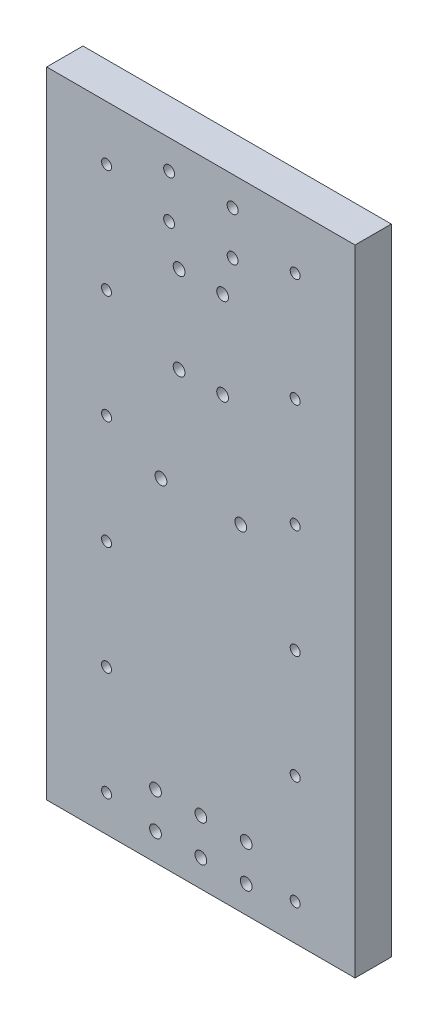
ISO-10303-21;
HEADER;
FILE_DESCRIPTION(('STEP AP214'),'2;1');
FILE_NAME('part.step','',(''),(''),'','','');
FILE_SCHEMA(('AUTOMOTIVE_DESIGN { 1 0 10303 214 1 1 1 1 }'));
ENDSEC;
DATA;
#1=APPLICATION_CONTEXT('core data for automotive mechanical design processes');
#2=APPLICATION_PROTOCOL_DEFINITION('international standard','automotive_design',2000,#1);
#3=PRODUCT_CONTEXT('',#1,'mechanical');
#4=PRODUCT('Part','Part','',(#3));
#5=PRODUCT_RELATED_PRODUCT_CATEGORY('part','',(#4));
#6=PRODUCT_DEFINITION_FORMATION('','',#4);
#7=PRODUCT_DEFINITION_CONTEXT('part definition',#1,'design');
#8=PRODUCT_DEFINITION('design','',#6,#7);
#9=PRODUCT_DEFINITION_SHAPE('','',#8);
#10=(LENGTH_UNIT() NAMED_UNIT(*) SI_UNIT(.MILLI.,.METRE.));
#11=(NAMED_UNIT(*) PLANE_ANGLE_UNIT() SI_UNIT($,.RADIAN.));
#12=(NAMED_UNIT(*) SI_UNIT($,.STERADIAN.) SOLID_ANGLE_UNIT());
#13=UNCERTAINTY_MEASURE_WITH_UNIT(LENGTH_MEASURE(1.E-05),#10,'distance_accuracy_value','');
#14=(GEOMETRIC_REPRESENTATION_CONTEXT(3) GLOBAL_UNCERTAINTY_ASSIGNED_CONTEXT((#13)) GLOBAL_UNIT_ASSIGNED_CONTEXT((#10,
#11,#12)) REPRESENTATION_CONTEXT('',''));
#15=CARTESIAN_POINT('',(0.,0.,0.));
#16=DIRECTION('',(0.,0.,1.));
#17=DIRECTION('',(1.,0.,0.));
#18=AXIS2_PLACEMENT_3D('',#15,#16,#17);
#19=CARTESIAN_POINT('',(-52.,320.,-30.));
#20=DIRECTION('',(0.,0.,1.));
#21=DIRECTION('',(1.,0.,0.));
#22=AXIS2_PLACEMENT_3D('',#19,#20,#21);
#23=CYLINDRICAL_SURFACE('',#22,2.75);
#24=CARTESIAN_POINT('',(-52.,320.,0.));
#25=DIRECTION('',(0.,0.,-1.));
#26=DIRECTION('',(-1.,0.,0.));
#27=AXIS2_PLACEMENT_3D('',#24,#25,#26);
#28=CIRCLE('',#27,2.75);
#29=CARTESIAN_POINT('',(-54.75,320.,0.));
#30=VERTEX_POINT('',#29);
#31=EDGE_CURVE('E43',#30,#30,#28,.T.);
#32=ORIENTED_EDGE('',*,*,#31,.T.);
#33=EDGE_LOOP('',(#32));
#34=FACE_BOUND('',#33,.T.);
#35=CARTESIAN_POINT('',(-52.,320.,20.));
#36=DIRECTION('',(0.,0.,1.));
#37=DIRECTION('',(-1.,0.,0.));
#38=AXIS2_PLACEMENT_3D('',#35,#36,#37);
#39=CIRCLE('',#38,2.75);
#40=CARTESIAN_POINT('',(-54.75,320.,20.));
#41=VERTEX_POINT('',#40);
#42=EDGE_CURVE('E11',#41,#41,#39,.T.);
#43=ORIENTED_EDGE('',*,*,#42,.T.);
#44=EDGE_LOOP('',(#43));
#45=FACE_BOUND('',#44,.T.);
#46=ADVANCED_FACE('F34',(#34,#45),#23,.F.);
#47=CARTESIAN_POINT('',(-52.,260.,-30.));
#48=DIRECTION('',(0.,0.,1.));
#49=DIRECTION('',(1.,0.,0.));
#50=AXIS2_PLACEMENT_3D('',#47,#48,#49);
#51=CYLINDRICAL_SURFACE('',#50,2.75);
#52=CARTESIAN_POINT('',(-52.,260.,0.));
#53=DIRECTION('',(0.,0.,-1.));
#54=DIRECTION('',(-1.,0.,0.));
#55=AXIS2_PLACEMENT_3D('',#52,#53,#54);
#56=CIRCLE('',#55,2.75);
#57=CARTESIAN_POINT('',(-54.75,260.,0.));
#58=VERTEX_POINT('',#57);
#59=EDGE_CURVE('E158',#58,#58,#56,.T.);
#60=ORIENTED_EDGE('',*,*,#59,.T.);
#61=EDGE_LOOP('',(#60));
#62=FACE_BOUND('',#61,.T.);
#63=CARTESIAN_POINT('',(-52.,260.,20.));
#64=DIRECTION('',(0.,0.,1.));
#65=DIRECTION('',(-1.,0.,0.));
#66=AXIS2_PLACEMENT_3D('',#63,#64,#65);
#67=CIRCLE('',#66,2.75);
#68=CARTESIAN_POINT('',(-54.75,260.,20.));
#69=VERTEX_POINT('',#68);
#70=EDGE_CURVE('E161',#69,#69,#67,.T.);
#71=ORIENTED_EDGE('',*,*,#70,.T.);
#72=EDGE_LOOP('',(#71));
#73=FACE_BOUND('',#72,.T.);
#74=ADVANCED_FACE('F286',(#62,#73),#51,.F.);
#75=CARTESIAN_POINT('',(-52.,200.,-30.));
#76=DIRECTION('',(0.,0.,1.));
#77=DIRECTION('',(1.,0.,0.));
#78=AXIS2_PLACEMENT_3D('',#75,#76,#77);
#79=CYLINDRICAL_SURFACE('',#78,2.75);
#80=CARTESIAN_POINT('',(-52.,200.,0.));
#81=DIRECTION('',(0.,0.,-1.));
#82=DIRECTION('',(-1.,0.,0.));
#83=AXIS2_PLACEMENT_3D('',#80,#81,#82);
#84=CIRCLE('',#83,2.75);
#85=CARTESIAN_POINT('',(-54.75,200.,0.));
#86=VERTEX_POINT('',#85);
#87=EDGE_CURVE('E152',#86,#86,#84,.T.);
#88=ORIENTED_EDGE('',*,*,#87,.T.);
#89=EDGE_LOOP('',(#88));
#90=FACE_BOUND('',#89,.T.);
#91=CARTESIAN_POINT('',(-52.,200.,20.));
#92=DIRECTION('',(0.,0.,1.));
#93=DIRECTION('',(-1.,0.,0.));
#94=AXIS2_PLACEMENT_3D('',#91,#92,#93);
#95=CIRCLE('',#94,2.75);
#96=CARTESIAN_POINT('',(-54.75,200.,20.));
#97=VERTEX_POINT('',#96);
#98=EDGE_CURVE('E155',#97,#97,#95,.T.);
#99=ORIENTED_EDGE('',*,*,#98,.T.);
#100=EDGE_LOOP('',(#99));
#101=FACE_BOUND('',#100,.T.);
#102=ADVANCED_FACE('F291',(#90,#101),#79,.F.);
#103=CARTESIAN_POINT('',(-52.,140.,-30.));
#104=DIRECTION('',(0.,0.,1.));
#105=DIRECTION('',(1.,0.,0.));
#106=AXIS2_PLACEMENT_3D('',#103,#104,#105);
#107=CYLINDRICAL_SURFACE('',#106,2.75);
#108=CARTESIAN_POINT('',(-52.,140.,0.));
#109=DIRECTION('',(0.,0.,-1.));
#110=DIRECTION('',(-1.,0.,0.));
#111=AXIS2_PLACEMENT_3D('',#108,#109,#110);
#112=CIRCLE('',#111,2.75);
#113=CARTESIAN_POINT('',(-54.75,140.,0.));
#114=VERTEX_POINT('',#113);
#115=EDGE_CURVE('E146',#114,#114,#112,.T.);
#116=ORIENTED_EDGE('',*,*,#115,.T.);
#117=EDGE_LOOP('',(#116));
#118=FACE_BOUND('',#117,.T.);
#119=CARTESIAN_POINT('',(-52.,140.,20.));
#120=DIRECTION('',(0.,0.,1.));
#121=DIRECTION('',(-1.,0.,0.));
#122=AXIS2_PLACEMENT_3D('',#119,#120,#121);
#123=CIRCLE('',#122,2.75);
#124=CARTESIAN_POINT('',(-54.75,140.,20.));
#125=VERTEX_POINT('',#124);
#126=EDGE_CURVE('E149',#125,#125,#123,.T.);
#127=ORIENTED_EDGE('',*,*,#126,.T.);
#128=EDGE_LOOP('',(#127));
#129=FACE_BOUND('',#128,.T.);
#130=ADVANCED_FACE('F337',(#118,#129),#107,.F.);
#131=CARTESIAN_POINT('',(52.,320.,-30.));
#132=DIRECTION('',(0.,0.,1.));
#133=DIRECTION('',(1.,0.,0.));
#134=AXIS2_PLACEMENT_3D('',#131,#132,#133);
#135=CYLINDRICAL_SURFACE('',#134,2.75);
#136=CARTESIAN_POINT('',(52.,320.,0.));
#137=DIRECTION('',(0.,0.,-1.));
#138=DIRECTION('',(-1.,0.,0.));
#139=AXIS2_PLACEMENT_3D('',#136,#137,#138);
#140=CIRCLE('',#139,2.75);
#141=CARTESIAN_POINT('',(49.25,320.,0.));
#142=VERTEX_POINT('',#141);
#143=EDGE_CURVE('E140',#142,#142,#140,.T.);
#144=ORIENTED_EDGE('',*,*,#143,.T.);
#145=EDGE_LOOP('',(#144));
#146=FACE_BOUND('',#145,.T.);
#147=CARTESIAN_POINT('',(52.,320.,20.));
#148=DIRECTION('',(0.,0.,1.));
#149=DIRECTION('',(1.,0.,0.));
#150=AXIS2_PLACEMENT_3D('',#147,#148,#149);
#151=CIRCLE('',#150,2.75);
#152=CARTESIAN_POINT('',(54.75,320.,20.));
#153=VERTEX_POINT('',#152);
#154=EDGE_CURVE('E143',#153,#153,#151,.T.);
#155=ORIENTED_EDGE('',*,*,#154,.T.);
#156=EDGE_LOOP('',(#155));
#157=FACE_BOUND('',#156,.T.);
#158=ADVANCED_FACE('F333',(#146,#157),#135,.F.);
#159=CARTESIAN_POINT('',(52.,260.,-30.));
#160=DIRECTION('',(0.,0.,1.));
#161=DIRECTION('',(1.,0.,0.));
#162=AXIS2_PLACEMENT_3D('',#159,#160,#161);
#163=CYLINDRICAL_SURFACE('',#162,2.75);
#164=CARTESIAN_POINT('',(52.,260.,0.));
#165=DIRECTION('',(0.,0.,-1.));
#166=DIRECTION('',(-1.,0.,0.));
#167=AXIS2_PLACEMENT_3D('',#164,#165,#166);
#168=CIRCLE('',#167,2.75);
#169=CARTESIAN_POINT('',(49.25,260.,0.));
#170=VERTEX_POINT('',#169);
#171=EDGE_CURVE('E134',#170,#170,#168,.T.);
#172=ORIENTED_EDGE('',*,*,#171,.T.);
#173=EDGE_LOOP('',(#172));
#174=FACE_BOUND('',#173,.T.);
#175=CARTESIAN_POINT('',(52.,260.,20.));
#176=DIRECTION('',(0.,0.,1.));
#177=DIRECTION('',(1.,0.,0.));
#178=AXIS2_PLACEMENT_3D('',#175,#176,#177);
#179=CIRCLE('',#178,2.75);
#180=CARTESIAN_POINT('',(54.75,260.,20.));
#181=VERTEX_POINT('',#180);
#182=EDGE_CURVE('E137',#181,#181,#179,.T.);
#183=ORIENTED_EDGE('',*,*,#182,.T.);
#184=EDGE_LOOP('',(#183));
#185=FACE_BOUND('',#184,.T.);
#186=ADVANCED_FACE('F329',(#174,#185),#163,.F.);
#187=CARTESIAN_POINT('',(52.,200.,-30.));
#188=DIRECTION('',(0.,0.,1.));
#189=DIRECTION('',(1.,0.,0.));
#190=AXIS2_PLACEMENT_3D('',#187,#188,#189);
#191=CYLINDRICAL_SURFACE('',#190,2.75);
#192=CARTESIAN_POINT('',(52.,200.,0.));
#193=DIRECTION('',(0.,0.,-1.));
#194=DIRECTION('',(-1.,0.,0.));
#195=AXIS2_PLACEMENT_3D('',#192,#193,#194);
#196=CIRCLE('',#195,2.75);
#197=CARTESIAN_POINT('',(49.25,200.,0.));
#198=VERTEX_POINT('',#197);
#199=EDGE_CURVE('E128',#198,#198,#196,.T.);
#200=ORIENTED_EDGE('',*,*,#199,.T.);
#201=EDGE_LOOP('',(#200));
#202=FACE_BOUND('',#201,.T.);
#203=CARTESIAN_POINT('',(52.,200.,20.));
#204=DIRECTION('',(0.,0.,1.));
#205=DIRECTION('',(1.,0.,0.));
#206=AXIS2_PLACEMENT_3D('',#203,#204,#205);
#207=CIRCLE('',#206,2.75);
#208=CARTESIAN_POINT('',(54.75,200.,20.));
#209=VERTEX_POINT('',#208);
#210=EDGE_CURVE('E131',#209,#209,#207,.T.);
#211=ORIENTED_EDGE('',*,*,#210,.T.);
#212=EDGE_LOOP('',(#211));
#213=FACE_BOUND('',#212,.T.);
#214=ADVANCED_FACE('F325',(#202,#213),#191,.F.);
#215=CARTESIAN_POINT('',(52.,140.,-30.));
#216=DIRECTION('',(0.,0.,1.));
#217=DIRECTION('',(1.,0.,0.));
#218=AXIS2_PLACEMENT_3D('',#215,#216,#217);
#219=CYLINDRICAL_SURFACE('',#218,2.75);
#220=CARTESIAN_POINT('',(52.,140.,0.));
#221=DIRECTION('',(0.,0.,-1.));
#222=DIRECTION('',(-1.,0.,0.));
#223=AXIS2_PLACEMENT_3D('',#220,#221,#222);
#224=CIRCLE('',#223,2.75);
#225=CARTESIAN_POINT('',(49.25,140.,0.));
#226=VERTEX_POINT('',#225);
#227=EDGE_CURVE('E114',#226,#226,#224,.T.);
#228=ORIENTED_EDGE('',*,*,#227,.T.);
#229=EDGE_LOOP('',(#228));
#230=FACE_BOUND('',#229,.T.);
#231=CARTESIAN_POINT('',(52.,140.,20.));
#232=DIRECTION('',(0.,0.,1.));
#233=DIRECTION('',(1.,0.,0.));
#234=AXIS2_PLACEMENT_3D('',#231,#232,#233);
#235=CIRCLE('',#234,2.75);
#236=CARTESIAN_POINT('',(54.75,140.,20.));
#237=VERTEX_POINT('',#236);
#238=EDGE_CURVE('E125',#237,#237,#235,.T.);
#239=ORIENTED_EDGE('',*,*,#238,.T.);
#240=EDGE_LOOP('',(#239));
#241=FACE_BOUND('',#240,.T.);
#242=ADVANCED_FACE('F321',(#230,#241),#219,.F.);
#243=CARTESIAN_POINT('',(-85.,0.,20.));
#244=DIRECTION('',(1.,0.,0.));
#245=DIRECTION('',(0.,0.,-1.));
#246=AXIS2_PLACEMENT_3D('',#243,#244,#245);
#247=PLANE('',#246);
#248=DIRECTION('',(0.,-1.,0.));
#249=VECTOR('',#248,1.);
#250=CARTESIAN_POINT('',(-85.,0.,0.));
#251=LINE('',#250,#249);
#252=CARTESIAN_POINT('',(-85.,350.,0.));
#253=VERTEX_POINT('',#252);
#254=CARTESIAN_POINT('',(-85.,0.,0.));
#255=VERTEX_POINT('',#254);
#256=EDGE_CURVE('E104',#253,#255,#251,.T.);
#257=ORIENTED_EDGE('',*,*,#256,.T.);
#258=DIRECTION('',(0.,0.,-1.));
#259=VECTOR('',#258,1.);
#260=CARTESIAN_POINT('',(-85.,0.,20.));
#261=LINE('',#260,#259);
#262=CARTESIAN_POINT('',(-85.,0.,20.));
#263=VERTEX_POINT('',#262);
#264=EDGE_CURVE('E95',#263,#255,#261,.T.);
#265=ORIENTED_EDGE('',*,*,#264,.F.);
#266=DIRECTION('',(0.,-1.,0.));
#267=VECTOR('',#266,1.);
#268=CARTESIAN_POINT('',(-85.,0.,20.));
#269=LINE('',#268,#267);
#270=CARTESIAN_POINT('',(-85.,350.,20.));
#271=VERTEX_POINT('',#270);
#272=EDGE_CURVE('E89',#271,#263,#269,.T.);
#273=ORIENTED_EDGE('',*,*,#272,.F.);
#274=DIRECTION('',(0.,0.,-1.));
#275=VECTOR('',#274,1.);
#276=CARTESIAN_POINT('',(-85.,350.,20.));
#277=LINE('',#276,#275);
#278=EDGE_CURVE('E100',#271,#253,#277,.T.);
#279=ORIENTED_EDGE('',*,*,#278,.T.);
#280=EDGE_LOOP('',(#257,#265,#273,#279));
#281=FACE_BOUND('',#280,.T.);
#282=ADVANCED_FACE('F318',(#281),#247,.F.);
#283=CARTESIAN_POINT('',(-85.,0.,20.));
#284=DIRECTION('',(0.,1.,0.));
#285=DIRECTION('',(0.,0.,1.));
#286=AXIS2_PLACEMENT_3D('',#283,#284,#285);
#287=PLANE('',#286);
#288=DIRECTION('',(1.,0.,0.));
#289=VECTOR('',#288,1.);
#290=CARTESIAN_POINT('',(-85.,0.,0.));
#291=LINE('',#290,#289);
#292=CARTESIAN_POINT('',(85.,0.,0.));
#293=VERTEX_POINT('',#292);
#294=EDGE_CURVE('E94',#255,#293,#291,.T.);
#295=ORIENTED_EDGE('',*,*,#294,.T.);
#296=DIRECTION('',(0.,0.,-1.));
#297=VECTOR('',#296,1.);
#298=CARTESIAN_POINT('',(85.,0.,20.));
#299=LINE('',#298,#297);
#300=CARTESIAN_POINT('',(85.,0.,20.));
#301=VERTEX_POINT('',#300);
#302=EDGE_CURVE('E92',#301,#293,#299,.T.);
#303=ORIENTED_EDGE('',*,*,#302,.F.);
#304=DIRECTION('',(1.,0.,0.));
#305=VECTOR('',#304,1.);
#306=CARTESIAN_POINT('',(-85.,0.,20.));
#307=LINE('',#306,#305);
#308=EDGE_CURVE('E83',#263,#301,#307,.T.);
#309=ORIENTED_EDGE('',*,*,#308,.F.);
#310=ORIENTED_EDGE('',*,*,#264,.T.);
#311=EDGE_LOOP('',(#295,#303,#309,#310));
#312=FACE_BOUND('',#311,.T.);
#313=ADVANCED_FACE('F93',(#312),#287,.F.);
#314=CARTESIAN_POINT('',(85.,0.,20.));
#315=DIRECTION('',(-1.,0.,0.));
#316=DIRECTION('',(0.,0.,1.));
#317=AXIS2_PLACEMENT_3D('',#314,#315,#316);
#318=PLANE('',#317);
#319=DIRECTION('',(0.,1.,0.));
#320=VECTOR('',#319,1.);
#321=CARTESIAN_POINT('',(85.,0.,0.));
#322=LINE('',#321,#320);
#323=CARTESIAN_POINT('',(85.,350.,0.));
#324=VERTEX_POINT('',#323);
#325=EDGE_CURVE('E69',#293,#324,#322,.T.);
#326=ORIENTED_EDGE('',*,*,#325,.T.);
#327=DIRECTION('',(0.,0.,-1.));
#328=VECTOR('',#327,1.);
#329=CARTESIAN_POINT('',(85.,350.,20.));
#330=LINE('',#329,#328);
#331=CARTESIAN_POINT('',(85.,350.,20.));
#332=VERTEX_POINT('',#331);
#333=EDGE_CURVE('E96',#332,#324,#330,.T.);
#334=ORIENTED_EDGE('',*,*,#333,.F.);
#335=DIRECTION('',(0.,1.,0.));
#336=VECTOR('',#335,1.);
#337=CARTESIAN_POINT('',(85.,0.,20.));
#338=LINE('',#337,#336);
#339=EDGE_CURVE('E87',#301,#332,#338,.T.);
#340=ORIENTED_EDGE('',*,*,#339,.F.);
#341=ORIENTED_EDGE('',*,*,#302,.T.);
#342=EDGE_LOOP('',(#326,#334,#340,#341));
#343=FACE_BOUND('',#342,.T.);
#344=ADVANCED_FACE('F98',(#343),#318,.F.);
#345=CARTESIAN_POINT('',(-85.,350.,20.));
#346=DIRECTION('',(0.,-1.,0.));
#347=DIRECTION('',(0.,0.,-1.));
#348=AXIS2_PLACEMENT_3D('',#345,#346,#347);
#349=PLANE('',#348);
#350=DIRECTION('',(-1.,0.,0.));
#351=VECTOR('',#350,1.);
#352=CARTESIAN_POINT('',(-85.,350.,0.));
#353=LINE('',#352,#351);
#354=EDGE_CURVE('E75',#324,#253,#353,.T.);
#355=ORIENTED_EDGE('',*,*,#354,.T.);
#356=ORIENTED_EDGE('',*,*,#278,.F.);
#357=DIRECTION('',(-1.,0.,0.));
#358=VECTOR('',#357,1.);
#359=CARTESIAN_POINT('',(-85.,350.,20.));
#360=LINE('',#359,#358);
#361=EDGE_CURVE('E52',#332,#271,#360,.T.);
#362=ORIENTED_EDGE('',*,*,#361,.F.);
#363=ORIENTED_EDGE('',*,*,#333,.T.);
#364=EDGE_LOOP('',(#355,#356,#362,#363));
#365=FACE_BOUND('',#364,.T.);
#366=ADVANCED_FACE('F299',(#365),#349,.F.);
#367=CARTESIAN_POINT('',(0.,0.,20.));
#368=DIRECTION('',(0.,0.,-1.));
#369=DIRECTION('',(-1.,0.,0.));
#370=AXIS2_PLACEMENT_3D('',#367,#368,#369);
#371=PLANE('',#370);
#372=CARTESIAN_POINT('',(-22.,185.,20.));
#373=DIRECTION('',(0.,0.,1.));
#374=DIRECTION('',(-1.,0.,0.));
#375=AXIS2_PLACEMENT_3D('',#372,#373,#374);
#376=CIRCLE('',#375,3.25);
#377=CARTESIAN_POINT('',(-25.25,185.,20.));
#378=VERTEX_POINT('',#377);
#379=EDGE_CURVE('E603',#378,#378,#376,.T.);
#380=ORIENTED_EDGE('',*,*,#379,.F.);
#381=EDGE_LOOP('',(#380));
#382=FACE_BOUND('',#381,.T.);
#383=CARTESIAN_POINT('',(-12.,290.,20.));
#384=DIRECTION('',(0.,0.,1.));
#385=DIRECTION('',(-1.,0.,0.));
#386=AXIS2_PLACEMENT_3D('',#383,#384,#385);
#387=CIRCLE('',#386,3.25);
#388=CARTESIAN_POINT('',(-15.25,290.,20.));
#389=VERTEX_POINT('',#388);
#390=EDGE_CURVE('E612',#389,#389,#387,.T.);
#391=ORIENTED_EDGE('',*,*,#390,.F.);
#392=EDGE_LOOP('',(#391));
#393=FACE_BOUND('',#392,.T.);
#394=CARTESIAN_POINT('',(12.,242.,20.));
#395=DIRECTION('',(0.,0.,1.));
#396=DIRECTION('',(1.,0.,0.));
#397=AXIS2_PLACEMENT_3D('',#394,#395,#396);
#398=CIRCLE('',#397,3.25);
#399=CARTESIAN_POINT('',(15.25,242.,20.));
#400=VERTEX_POINT('',#399);
#401=EDGE_CURVE('E609',#400,#400,#398,.T.);
#402=ORIENTED_EDGE('',*,*,#401,.F.);
#403=EDGE_LOOP('',(#402));
#404=FACE_BOUND('',#403,.T.);
#405=CARTESIAN_POINT('',(-12.,242.,20.));
#406=DIRECTION('',(0.,0.,1.));
#407=DIRECTION('',(-1.,0.,0.));
#408=AXIS2_PLACEMENT_3D('',#405,#406,#407);
#409=CIRCLE('',#408,3.25);
#410=CARTESIAN_POINT('',(-15.25,242.,20.));
#411=VERTEX_POINT('',#410);
#412=EDGE_CURVE('E606',#411,#411,#409,.T.);
#413=ORIENTED_EDGE('',*,*,#412,.F.);
#414=EDGE_LOOP('',(#413));
#415=FACE_BOUND('',#414,.T.);
#416=CARTESIAN_POINT('',(22.,185.,20.));
#417=DIRECTION('',(0.,0.,1.));
#418=DIRECTION('',(1.,0.,0.));
#419=AXIS2_PLACEMENT_3D('',#416,#417,#418);
#420=CIRCLE('',#419,3.25);
#421=CARTESIAN_POINT('',(25.25,185.,20.));
#422=VERTEX_POINT('',#421);
#423=EDGE_CURVE('E604',#422,#422,#420,.T.);
#424=ORIENTED_EDGE('',*,*,#423,.F.);
#425=EDGE_LOOP('',(#424));
#426=FACE_BOUND('',#425,.T.);
#427=CARTESIAN_POINT('',(12.,290.,20.));
#428=DIRECTION('',(0.,0.,1.));
#429=DIRECTION('',(1.,0.,0.));
#430=AXIS2_PLACEMENT_3D('',#427,#428,#429);
#431=CIRCLE('',#430,3.25);
#432=CARTESIAN_POINT('',(15.25,290.,20.));
#433=VERTEX_POINT('',#432);
#434=EDGE_CURVE('E190',#433,#433,#431,.T.);
#435=ORIENTED_EDGE('',*,*,#434,.F.);
#436=EDGE_LOOP('',(#435));
#437=FACE_BOUND('',#436,.T.);
#438=CARTESIAN_POINT('',(25.,15.,20.));
#439=DIRECTION('',(0.,0.,1.));
#440=DIRECTION('',(1.,0.,0.));
#441=AXIS2_PLACEMENT_3D('',#438,#439,#440);
#442=CIRCLE('',#441,3.25);
#443=CARTESIAN_POINT('',(28.25,15.,20.));
#444=VERTEX_POINT('',#443);
#445=EDGE_CURVE('E217',#444,#444,#442,.T.);
#446=ORIENTED_EDGE('',*,*,#445,.F.);
#447=EDGE_LOOP('',(#446));
#448=FACE_BOUND('',#447,.T.);
#449=CARTESIAN_POINT('',(-25.,15.,20.));
#450=DIRECTION('',(0.,0.,1.));
#451=DIRECTION('',(-1.,0.,0.));
#452=AXIS2_PLACEMENT_3D('',#449,#450,#451);
#453=CIRCLE('',#452,3.25);
#454=CARTESIAN_POINT('',(-28.25,15.,20.));
#455=VERTEX_POINT('',#454);
#456=EDGE_CURVE('E220',#455,#455,#453,.T.);
#457=ORIENTED_EDGE('',*,*,#456,.F.);
#458=EDGE_LOOP('',(#457));
#459=FACE_BOUND('',#458,.T.);
#460=CARTESIAN_POINT('',(25.,35.,20.));
#461=DIRECTION('',(0.,0.,1.));
#462=DIRECTION('',(-1.,0.,0.));
#463=AXIS2_PLACEMENT_3D('',#460,#461,#462);
#464=CIRCLE('',#463,3.25);
#465=CARTESIAN_POINT('',(21.75,35.,20.));
#466=VERTEX_POINT('',#465);
#467=EDGE_CURVE('E212',#466,#466,#464,.T.);
#468=ORIENTED_EDGE('',*,*,#467,.F.);
#469=EDGE_LOOP('',(#468));
#470=FACE_BOUND('',#469,.T.);
#471=CARTESIAN_POINT('',(0.,35.,20.));
#472=DIRECTION('',(0.,0.,1.));
#473=DIRECTION('',(-1.,0.,0.));
#474=AXIS2_PLACEMENT_3D('',#471,#472,#473);
#475=CIRCLE('',#474,3.25);
#476=CARTESIAN_POINT('',(-3.25,35.,20.));
#477=VERTEX_POINT('',#476);
#478=EDGE_CURVE('E207',#477,#477,#475,.T.);
#479=ORIENTED_EDGE('',*,*,#478,.F.);
#480=EDGE_LOOP('',(#479));
#481=FACE_BOUND('',#480,.T.);
#482=CARTESIAN_POINT('',(-25.,35.,20.));
#483=DIRECTION('',(0.,0.,1.));
#484=DIRECTION('',(1.,0.,0.));
#485=AXIS2_PLACEMENT_3D('',#482,#483,#484);
#486=CIRCLE('',#485,3.25);
#487=CARTESIAN_POINT('',(-21.75,35.,20.));
#488=VERTEX_POINT('',#487);
#489=EDGE_CURVE('E203',#488,#488,#486,.T.);
#490=ORIENTED_EDGE('',*,*,#489,.F.);
#491=EDGE_LOOP('',(#490));
#492=FACE_BOUND('',#491,.T.);
#493=CARTESIAN_POINT('',(0.,15.,20.));
#494=DIRECTION('',(0.,0.,1.));
#495=DIRECTION('',(1.,0.,0.));
#496=AXIS2_PLACEMENT_3D('',#493,#494,#495);
#497=CIRCLE('',#496,3.25);
#498=CARTESIAN_POINT('',(3.25,15.,20.));
#499=VERTEX_POINT('',#498);
#500=EDGE_CURVE('E170',#499,#499,#497,.T.);
#501=ORIENTED_EDGE('',*,*,#500,.F.);
#502=EDGE_LOOP('',(#501));
#503=FACE_BOUND('',#502,.T.);
#504=CARTESIAN_POINT('',(-52.,80.,20.));
#505=DIRECTION('',(0.,0.,1.));
#506=DIRECTION('',(-1.,0.,0.));
#507=AXIS2_PLACEMENT_3D('',#504,#505,#506);
#508=CIRCLE('',#507,2.75);
#509=CARTESIAN_POINT('',(-54.75,80.,20.));
#510=VERTEX_POINT('',#509);
#511=EDGE_CURVE('E229',#510,#510,#508,.T.);
#512=ORIENTED_EDGE('',*,*,#511,.F.);
#513=EDGE_LOOP('',(#512));
#514=FACE_BOUND('',#513,.T.);
#515=CARTESIAN_POINT('',(52.,80.,20.));
#516=DIRECTION('',(0.,0.,1.));
#517=DIRECTION('',(1.,0.,0.));
#518=AXIS2_PLACEMENT_3D('',#515,#516,#517);
#519=CIRCLE('',#518,2.75);
#520=CARTESIAN_POINT('',(54.75,80.,20.));
#521=VERTEX_POINT('',#520);
#522=EDGE_CURVE('E235',#521,#521,#519,.T.);
#523=ORIENTED_EDGE('',*,*,#522,.F.);
#524=EDGE_LOOP('',(#523));
#525=FACE_BOUND('',#524,.T.);
#526=CARTESIAN_POINT('',(52.,20.,20.));
#527=DIRECTION('',(0.,0.,1.));
#528=DIRECTION('',(1.,0.,0.));
#529=AXIS2_PLACEMENT_3D('',#526,#527,#528);
#530=CIRCLE('',#529,2.75);
#531=CARTESIAN_POINT('',(54.75,20.,20.));
#532=VERTEX_POINT('',#531);
#533=EDGE_CURVE('E119',#532,#532,#530,.T.);
#534=ORIENTED_EDGE('',*,*,#533,.F.);
#535=EDGE_LOOP('',(#534));
#536=FACE_BOUND('',#535,.T.);
#537=CARTESIAN_POINT('',(-52.,20.,20.));
#538=DIRECTION('',(0.,0.,1.));
#539=DIRECTION('',(-1.,0.,0.));
#540=AXIS2_PLACEMENT_3D('',#537,#538,#539);
#541=CIRCLE('',#540,2.75);
#542=CARTESIAN_POINT('',(-54.75,20.,20.));
#543=VERTEX_POINT('',#542);
#544=EDGE_CURVE('E238',#543,#543,#541,.T.);
#545=ORIENTED_EDGE('',*,*,#544,.F.);
#546=EDGE_LOOP('',(#545));
#547=FACE_BOUND('',#546,.T.);
#548=CARTESIAN_POINT('',(17.5,334.,20.));
#549=DIRECTION('',(0.,0.,-1.));
#550=DIRECTION('',(-1.,0.,0.));
#551=AXIS2_PLACEMENT_3D('',#548,#549,#550);
#552=CIRCLE('',#551,3.);
#553=CARTESIAN_POINT('',(14.5,334.,20.));
#554=VERTEX_POINT('',#553);
#555=EDGE_CURVE('E107',#554,#554,#552,.T.);
#556=ORIENTED_EDGE('',*,*,#555,.T.);
#557=EDGE_LOOP('',(#556));
#558=FACE_BOUND('',#557,.T.);
#559=CARTESIAN_POINT('',(17.5,310.,20.));
#560=DIRECTION('',(0.,0.,-1.));
#561=DIRECTION('',(-1.,0.,0.));
#562=AXIS2_PLACEMENT_3D('',#559,#560,#561);
#563=CIRCLE('',#562,3.);
#564=CARTESIAN_POINT('',(14.5,310.,20.));
#565=VERTEX_POINT('',#564);
#566=EDGE_CURVE('E260',#565,#565,#563,.T.);
#567=ORIENTED_EDGE('',*,*,#566,.T.);
#568=EDGE_LOOP('',(#567));
#569=FACE_BOUND('',#568,.T.);
#570=CARTESIAN_POINT('',(-17.5,310.,20.));
#571=DIRECTION('',(0.,0.,-1.));
#572=DIRECTION('',(-1.,0.,0.));
#573=AXIS2_PLACEMENT_3D('',#570,#571,#572);
#574=CIRCLE('',#573,3.);
#575=CARTESIAN_POINT('',(-20.5,310.,20.));
#576=VERTEX_POINT('',#575);
#577=EDGE_CURVE('E257',#576,#576,#574,.T.);
#578=ORIENTED_EDGE('',*,*,#577,.T.);
#579=EDGE_LOOP('',(#578));
#580=FACE_BOUND('',#579,.T.);
#581=CARTESIAN_POINT('',(-17.5,334.,20.));
#582=DIRECTION('',(0.,0.,-1.));
#583=DIRECTION('',(-1.,0.,0.));
#584=AXIS2_PLACEMENT_3D('',#581,#582,#583);
#585=CIRCLE('',#584,3.);
#586=CARTESIAN_POINT('',(-20.5,334.,20.));
#587=VERTEX_POINT('',#586);
#588=EDGE_CURVE('E254',#587,#587,#585,.T.);
#589=ORIENTED_EDGE('',*,*,#588,.T.);
#590=EDGE_LOOP('',(#589));
#591=FACE_BOUND('',#590,.T.);
#592=ORIENTED_EDGE('',*,*,#272,.T.);
#593=ORIENTED_EDGE('',*,*,#308,.T.);
#594=ORIENTED_EDGE('',*,*,#339,.T.);
#595=ORIENTED_EDGE('',*,*,#361,.T.);
#596=EDGE_LOOP('',(#592,#593,#594,#595));
#597=FACE_BOUND('',#596,.T.);
#598=ORIENTED_EDGE('',*,*,#238,.F.);
#599=EDGE_LOOP('',(#598));
#600=FACE_BOUND('',#599,.T.);
#601=ORIENTED_EDGE('',*,*,#210,.F.);
#602=EDGE_LOOP('',(#601));
#603=FACE_BOUND('',#602,.T.);
#604=ORIENTED_EDGE('',*,*,#182,.F.);
#605=EDGE_LOOP('',(#604));
#606=FACE_BOUND('',#605,.T.);
#607=ORIENTED_EDGE('',*,*,#154,.F.);
#608=EDGE_LOOP('',(#607));
#609=FACE_BOUND('',#608,.T.);
#610=ORIENTED_EDGE('',*,*,#126,.F.);
#611=EDGE_LOOP('',(#610));
#612=FACE_BOUND('',#611,.T.);
#613=ORIENTED_EDGE('',*,*,#98,.F.);
#614=EDGE_LOOP('',(#613));
#615=FACE_BOUND('',#614,.T.);
#616=ORIENTED_EDGE('',*,*,#70,.F.);
#617=EDGE_LOOP('',(#616));
#618=FACE_BOUND('',#617,.T.);
#619=ORIENTED_EDGE('',*,*,#42,.F.);
#620=EDGE_LOOP('',(#619));
#621=FACE_BOUND('',#620,.T.);
#622=ADVANCED_FACE('F84',(#382,#393,#404,#415,#426,#437,#448,#459,#470,#481,#492,#503,#514,#525,
#536,#547,#558,#569,#580,#591,#597,#600,#603,#606,#609,#612,#615,#618,#621),#371,.F.);
#623=CARTESIAN_POINT('',(0.,0.,0.));
#624=DIRECTION('',(0.,0.,-1.));
#625=DIRECTION('',(-1.,0.,0.));
#626=AXIS2_PLACEMENT_3D('',#623,#624,#625);
#627=PLANE('',#626);
#628=CARTESIAN_POINT('',(-22.,185.,0.));
#629=DIRECTION('',(0.,0.,-1.));
#630=DIRECTION('',(-1.,0.,0.));
#631=AXIS2_PLACEMENT_3D('',#628,#629,#630);
#632=CIRCLE('',#631,3.25);
#633=CARTESIAN_POINT('',(-25.25,185.,0.));
#634=VERTEX_POINT('',#633);
#635=EDGE_CURVE('E37',#634,#634,#632,.T.);
#636=ORIENTED_EDGE('',*,*,#635,.F.);
#637=EDGE_LOOP('',(#636));
#638=FACE_BOUND('',#637,.T.);
#639=CARTESIAN_POINT('',(-12.,290.,0.));
#640=DIRECTION('',(0.,0.,-1.));
#641=DIRECTION('',(-1.,0.,0.));
#642=AXIS2_PLACEMENT_3D('',#639,#640,#641);
#643=CIRCLE('',#642,3.25);
#644=CARTESIAN_POINT('',(-15.25,290.,0.));
#645=VERTEX_POINT('',#644);
#646=EDGE_CURVE('E198',#645,#645,#643,.T.);
#647=ORIENTED_EDGE('',*,*,#646,.F.);
#648=EDGE_LOOP('',(#647));
#649=FACE_BOUND('',#648,.T.);
#650=CARTESIAN_POINT('',(12.,242.,0.));
#651=DIRECTION('',(0.,0.,-1.));
#652=DIRECTION('',(-1.,0.,0.));
#653=AXIS2_PLACEMENT_3D('',#650,#651,#652);
#654=CIRCLE('',#653,3.25);
#655=CARTESIAN_POINT('',(8.75,242.,0.));
#656=VERTEX_POINT('',#655);
#657=EDGE_CURVE('E196',#656,#656,#654,.T.);
#658=ORIENTED_EDGE('',*,*,#657,.F.);
#659=EDGE_LOOP('',(#658));
#660=FACE_BOUND('',#659,.T.);
#661=CARTESIAN_POINT('',(-12.,242.,0.));
#662=DIRECTION('',(0.,0.,-1.));
#663=DIRECTION('',(-1.,0.,0.));
#664=AXIS2_PLACEMENT_3D('',#661,#662,#663);
#665=CIRCLE('',#664,3.25);
#666=CARTESIAN_POINT('',(-15.25,242.,0.));
#667=VERTEX_POINT('',#666);
#668=EDGE_CURVE('E193',#667,#667,#665,.T.);
#669=ORIENTED_EDGE('',*,*,#668,.F.);
#670=EDGE_LOOP('',(#669));
#671=FACE_BOUND('',#670,.T.);
#672=CARTESIAN_POINT('',(22.,185.,0.));
#673=DIRECTION('',(0.,0.,-1.));
#674=DIRECTION('',(-1.,0.,0.));
#675=AXIS2_PLACEMENT_3D('',#672,#673,#674);
#676=CIRCLE('',#675,3.25);
#677=CARTESIAN_POINT('',(18.75,185.,0.));
#678=VERTEX_POINT('',#677);
#679=EDGE_CURVE('E189',#678,#678,#676,.T.);
#680=ORIENTED_EDGE('',*,*,#679,.F.);
#681=EDGE_LOOP('',(#680));
#682=FACE_BOUND('',#681,.T.);
#683=CARTESIAN_POINT('',(12.,290.,0.));
#684=DIRECTION('',(0.,0.,-1.));
#685=DIRECTION('',(-1.,0.,0.));
#686=AXIS2_PLACEMENT_3D('',#683,#684,#685);
#687=CIRCLE('',#686,3.25);
#688=CARTESIAN_POINT('',(8.75,290.,0.));
#689=VERTEX_POINT('',#688);
#690=EDGE_CURVE('E186',#689,#689,#687,.T.);
#691=ORIENTED_EDGE('',*,*,#690,.F.);
#692=EDGE_LOOP('',(#691));
#693=FACE_BOUND('',#692,.T.);
#694=CARTESIAN_POINT('',(25.,15.,0.));
#695=DIRECTION('',(0.,0.,-1.));
#696=DIRECTION('',(-1.,0.,0.));
#697=AXIS2_PLACEMENT_3D('',#694,#695,#696);
#698=CIRCLE('',#697,3.25);
#699=CARTESIAN_POINT('',(21.75,15.,0.));
#700=VERTEX_POINT('',#699);
#701=EDGE_CURVE('E182',#700,#700,#698,.T.);
#702=ORIENTED_EDGE('',*,*,#701,.F.);
#703=EDGE_LOOP('',(#702));
#704=FACE_BOUND('',#703,.T.);
#705=CARTESIAN_POINT('',(-25.,15.,0.));
#706=DIRECTION('',(0.,0.,-1.));
#707=DIRECTION('',(-1.,0.,0.));
#708=AXIS2_PLACEMENT_3D('',#705,#706,#707);
#709=CIRCLE('',#708,3.25);
#710=CARTESIAN_POINT('',(-28.25,15.,0.));
#711=VERTEX_POINT('',#710);
#712=EDGE_CURVE('E179',#711,#711,#709,.T.);
#713=ORIENTED_EDGE('',*,*,#712,.F.);
#714=EDGE_LOOP('',(#713));
#715=FACE_BOUND('',#714,.T.);
#716=CARTESIAN_POINT('',(25.,35.,0.));
#717=DIRECTION('',(0.,0.,-1.));
#718=DIRECTION('',(-1.,0.,0.));
#719=AXIS2_PLACEMENT_3D('',#716,#717,#718);
#720=CIRCLE('',#719,3.25);
#721=CARTESIAN_POINT('',(21.75,35.,0.));
#722=VERTEX_POINT('',#721);
#723=EDGE_CURVE('E176',#722,#722,#720,.T.);
#724=ORIENTED_EDGE('',*,*,#723,.F.);
#725=EDGE_LOOP('',(#724));
#726=FACE_BOUND('',#725,.T.);
#727=CARTESIAN_POINT('',(0.,35.,0.));
#728=DIRECTION('',(0.,0.,-1.));
#729=DIRECTION('',(-1.,0.,0.));
#730=AXIS2_PLACEMENT_3D('',#727,#728,#729);
#731=CIRCLE('',#730,3.25);
#732=CARTESIAN_POINT('',(-3.25,35.,0.));
#733=VERTEX_POINT('',#732);
#734=EDGE_CURVE('E173',#733,#733,#731,.T.);
#735=ORIENTED_EDGE('',*,*,#734,.F.);
#736=EDGE_LOOP('',(#735));
#737=FACE_BOUND('',#736,.T.);
#738=CARTESIAN_POINT('',(-25.,35.,0.));
#739=DIRECTION('',(0.,0.,-1.));
#740=DIRECTION('',(-1.,0.,0.));
#741=AXIS2_PLACEMENT_3D('',#738,#739,#740);
#742=CIRCLE('',#741,3.25);
#743=CARTESIAN_POINT('',(-28.25,35.,0.));
#744=VERTEX_POINT('',#743);
#745=EDGE_CURVE('E169',#744,#744,#742,.T.);
#746=ORIENTED_EDGE('',*,*,#745,.F.);
#747=EDGE_LOOP('',(#746));
#748=FACE_BOUND('',#747,.T.);
#749=CARTESIAN_POINT('',(0.,15.,0.));
#750=DIRECTION('',(0.,0.,-1.));
#751=DIRECTION('',(-1.,0.,0.));
#752=AXIS2_PLACEMENT_3D('',#749,#750,#751);
#753=CIRCLE('',#752,3.25);
#754=CARTESIAN_POINT('',(-3.25,15.,0.));
#755=VERTEX_POINT('',#754);
#756=EDGE_CURVE('E166',#755,#755,#753,.T.);
#757=ORIENTED_EDGE('',*,*,#756,.F.);
#758=EDGE_LOOP('',(#757));
#759=FACE_BOUND('',#758,.T.);
#760=CARTESIAN_POINT('',(-52.,80.,0.));
#761=DIRECTION('',(0.,0.,-1.));
#762=DIRECTION('',(-1.,0.,0.));
#763=AXIS2_PLACEMENT_3D('',#760,#761,#762);
#764=CIRCLE('',#763,2.75);
#765=CARTESIAN_POINT('',(-54.75,80.,0.));
#766=VERTEX_POINT('',#765);
#767=EDGE_CURVE('E185',#766,#766,#764,.T.);
#768=ORIENTED_EDGE('',*,*,#767,.F.);
#769=EDGE_LOOP('',(#768));
#770=FACE_BOUND('',#769,.T.);
#771=CARTESIAN_POINT('',(52.,80.,0.));
#772=DIRECTION('',(0.,0.,-1.));
#773=DIRECTION('',(-1.,0.,0.));
#774=AXIS2_PLACEMENT_3D('',#771,#772,#773);
#775=CIRCLE('',#774,2.75);
#776=CARTESIAN_POINT('',(49.25,80.,0.));
#777=VERTEX_POINT('',#776);
#778=EDGE_CURVE('E232',#777,#777,#775,.T.);
#779=ORIENTED_EDGE('',*,*,#778,.F.);
#780=EDGE_LOOP('',(#779));
#781=FACE_BOUND('',#780,.T.);
#782=CARTESIAN_POINT('',(52.,20.,0.));
#783=DIRECTION('',(0.,0.,-1.));
#784=DIRECTION('',(-1.,0.,0.));
#785=AXIS2_PLACEMENT_3D('',#782,#783,#784);
#786=CIRCLE('',#785,2.75);
#787=CARTESIAN_POINT('',(49.25,20.,0.));
#788=VERTEX_POINT('',#787);
#789=EDGE_CURVE('E118',#788,#788,#786,.T.);
#790=ORIENTED_EDGE('',*,*,#789,.F.);
#791=EDGE_LOOP('',(#790));
#792=FACE_BOUND('',#791,.T.);
#793=CARTESIAN_POINT('',(-52.,20.,0.));
#794=DIRECTION('',(0.,0.,-1.));
#795=DIRECTION('',(-1.,0.,0.));
#796=AXIS2_PLACEMENT_3D('',#793,#794,#795);
#797=CIRCLE('',#796,2.75);
#798=CARTESIAN_POINT('',(-54.75,20.,0.));
#799=VERTEX_POINT('',#798);
#800=EDGE_CURVE('E115',#799,#799,#797,.T.);
#801=ORIENTED_EDGE('',*,*,#800,.F.);
#802=EDGE_LOOP('',(#801));
#803=FACE_BOUND('',#802,.T.);
#804=CARTESIAN_POINT('',(17.5,334.,0.));
#805=DIRECTION('',(0.,0.,-1.));
#806=DIRECTION('',(1.,0.,0.));
#807=AXIS2_PLACEMENT_3D('',#804,#805,#806);
#808=CIRCLE('',#807,3.);
#809=CARTESIAN_POINT('',(20.5,334.,0.));
#810=VERTEX_POINT('',#809);
#811=EDGE_CURVE('E122',#810,#810,#808,.T.);
#812=ORIENTED_EDGE('',*,*,#811,.F.);
#813=EDGE_LOOP('',(#812));
#814=FACE_BOUND('',#813,.T.);
#815=CARTESIAN_POINT('',(17.5,310.,0.));
#816=DIRECTION('',(0.,0.,-1.));
#817=DIRECTION('',(1.,0.,0.));
#818=AXIS2_PLACEMENT_3D('',#815,#816,#817);
#819=CIRCLE('',#818,3.);
#820=CARTESIAN_POINT('',(20.5,310.,0.));
#821=VERTEX_POINT('',#820);
#822=EDGE_CURVE('E247',#821,#821,#819,.T.);
#823=ORIENTED_EDGE('',*,*,#822,.F.);
#824=EDGE_LOOP('',(#823));
#825=FACE_BOUND('',#824,.T.);
#826=CARTESIAN_POINT('',(-17.5,310.,0.));
#827=DIRECTION('',(0.,0.,-1.));
#828=DIRECTION('',(-1.,0.,0.));
#829=AXIS2_PLACEMENT_3D('',#826,#827,#828);
#830=CIRCLE('',#829,3.);
#831=CARTESIAN_POINT('',(-20.5,310.,0.));
#832=VERTEX_POINT('',#831);
#833=EDGE_CURVE('E243',#832,#832,#830,.T.);
#834=ORIENTED_EDGE('',*,*,#833,.F.);
#835=EDGE_LOOP('',(#834));
#836=FACE_BOUND('',#835,.T.);
#837=CARTESIAN_POINT('',(-17.5,334.,0.));
#838=DIRECTION('',(0.,0.,-1.));
#839=DIRECTION('',(-1.,0.,0.));
#840=AXIS2_PLACEMENT_3D('',#837,#838,#839);
#841=CIRCLE('',#840,3.);
#842=CARTESIAN_POINT('',(-20.5,334.,0.));
#843=VERTEX_POINT('',#842);
#844=EDGE_CURVE('E246',#843,#843,#841,.T.);
#845=ORIENTED_EDGE('',*,*,#844,.F.);
#846=EDGE_LOOP('',(#845));
#847=FACE_BOUND('',#846,.T.);
#848=ORIENTED_EDGE('',*,*,#256,.F.);
#849=ORIENTED_EDGE('',*,*,#354,.F.);
#850=ORIENTED_EDGE('',*,*,#325,.F.);
#851=ORIENTED_EDGE('',*,*,#294,.F.);
#852=EDGE_LOOP('',(#848,#849,#850,#851));
#853=FACE_BOUND('',#852,.T.);
#854=ORIENTED_EDGE('',*,*,#227,.F.);
#855=EDGE_LOOP('',(#854));
#856=FACE_BOUND('',#855,.T.);
#857=ORIENTED_EDGE('',*,*,#199,.F.);
#858=EDGE_LOOP('',(#857));
#859=FACE_BOUND('',#858,.T.);
#860=ORIENTED_EDGE('',*,*,#171,.F.);
#861=EDGE_LOOP('',(#860));
#862=FACE_BOUND('',#861,.T.);
#863=ORIENTED_EDGE('',*,*,#143,.F.);
#864=EDGE_LOOP('',(#863));
#865=FACE_BOUND('',#864,.T.);
#866=ORIENTED_EDGE('',*,*,#115,.F.);
#867=EDGE_LOOP('',(#866));
#868=FACE_BOUND('',#867,.T.);
#869=ORIENTED_EDGE('',*,*,#87,.F.);
#870=EDGE_LOOP('',(#869));
#871=FACE_BOUND('',#870,.T.);
#872=ORIENTED_EDGE('',*,*,#59,.F.);
#873=EDGE_LOOP('',(#872));
#874=FACE_BOUND('',#873,.T.);
#875=ORIENTED_EDGE('',*,*,#31,.F.);
#876=EDGE_LOOP('',(#875));
#877=FACE_BOUND('',#876,.T.);
#878=ADVANCED_FACE('F298',(#638,#649,#660,#671,#682,#693,#704,#715,#726,#737,#748,#759,#770,
#781,#792,#803,#814,#825,#836,#847,#853,#856,#859,#862,#865,#868,#871,#874,#877),#627,.T.);
#879=CARTESIAN_POINT('',(-17.5,334.,30.));
#880=DIRECTION('',(0.,0.,-1.));
#881=DIRECTION('',(-1.,0.,0.));
#882=AXIS2_PLACEMENT_3D('',#879,#880,#881);
#883=CYLINDRICAL_SURFACE('',#882,3.);
#884=ORIENTED_EDGE('',*,*,#844,.T.);
#885=EDGE_LOOP('',(#884));
#886=FACE_BOUND('',#885,.T.);
#887=ORIENTED_EDGE('',*,*,#588,.F.);
#888=EDGE_LOOP('',(#887));
#889=FACE_BOUND('',#888,.T.);
#890=ADVANCED_FACE('F306',(#886,#889),#883,.F.);
#891=CARTESIAN_POINT('',(-17.5,310.,30.));
#892=DIRECTION('',(0.,0.,-1.));
#893=DIRECTION('',(-1.,0.,0.));
#894=AXIS2_PLACEMENT_3D('',#891,#892,#893);
#895=CYLINDRICAL_SURFACE('',#894,3.);
#896=ORIENTED_EDGE('',*,*,#833,.T.);
#897=EDGE_LOOP('',(#896));
#898=FACE_BOUND('',#897,.T.);
#899=ORIENTED_EDGE('',*,*,#577,.F.);
#900=EDGE_LOOP('',(#899));
#901=FACE_BOUND('',#900,.T.);
#902=ADVANCED_FACE('F281',(#898,#901),#895,.F.);
#903=CARTESIAN_POINT('',(17.5,310.,30.));
#904=DIRECTION('',(0.,0.,-1.));
#905=DIRECTION('',(-1.,0.,0.));
#906=AXIS2_PLACEMENT_3D('',#903,#904,#905);
#907=CYLINDRICAL_SURFACE('',#906,3.);
#908=ORIENTED_EDGE('',*,*,#822,.T.);
#909=EDGE_LOOP('',(#908));
#910=FACE_BOUND('',#909,.T.);
#911=ORIENTED_EDGE('',*,*,#566,.F.);
#912=EDGE_LOOP('',(#911));
#913=FACE_BOUND('',#912,.T.);
#914=ADVANCED_FACE('F271',(#910,#913),#907,.F.);
#915=CARTESIAN_POINT('',(17.5,334.,30.));
#916=DIRECTION('',(0.,0.,-1.));
#917=DIRECTION('',(-1.,0.,0.));
#918=AXIS2_PLACEMENT_3D('',#915,#916,#917);
#919=CYLINDRICAL_SURFACE('',#918,3.);
#920=ORIENTED_EDGE('',*,*,#811,.T.);
#921=EDGE_LOOP('',(#920));
#922=FACE_BOUND('',#921,.T.);
#923=ORIENTED_EDGE('',*,*,#555,.F.);
#924=EDGE_LOOP('',(#923));
#925=FACE_BOUND('',#924,.T.);
#926=ADVANCED_FACE('F268',(#922,#925),#919,.F.);
#927=CARTESIAN_POINT('',(-52.,20.,-30.));
#928=DIRECTION('',(0.,0.,1.));
#929=DIRECTION('',(1.,0.,0.));
#930=AXIS2_PLACEMENT_3D('',#927,#928,#929);
#931=CYLINDRICAL_SURFACE('',#930,2.75);
#932=ORIENTED_EDGE('',*,*,#800,.T.);
#933=EDGE_LOOP('',(#932));
#934=FACE_BOUND('',#933,.T.);
#935=ORIENTED_EDGE('',*,*,#544,.T.);
#936=EDGE_LOOP('',(#935));
#937=FACE_BOUND('',#936,.T.);
#938=ADVANCED_FACE('F270',(#934,#937),#931,.F.);
#939=CARTESIAN_POINT('',(52.,20.,-30.));
#940=DIRECTION('',(0.,0.,1.));
#941=DIRECTION('',(1.,0.,0.));
#942=AXIS2_PLACEMENT_3D('',#939,#940,#941);
#943=CYLINDRICAL_SURFACE('',#942,2.75);
#944=ORIENTED_EDGE('',*,*,#789,.T.);
#945=EDGE_LOOP('',(#944));
#946=FACE_BOUND('',#945,.T.);
#947=ORIENTED_EDGE('',*,*,#533,.T.);
#948=EDGE_LOOP('',(#947));
#949=FACE_BOUND('',#948,.T.);
#950=ADVANCED_FACE('F278',(#946,#949),#943,.F.);
#951=CARTESIAN_POINT('',(52.,80.,-30.));
#952=DIRECTION('',(0.,0.,1.));
#953=DIRECTION('',(1.,0.,0.));
#954=AXIS2_PLACEMENT_3D('',#951,#952,#953);
#955=CYLINDRICAL_SURFACE('',#954,2.75);
#956=ORIENTED_EDGE('',*,*,#778,.T.);
#957=EDGE_LOOP('',(#956));
#958=FACE_BOUND('',#957,.T.);
#959=ORIENTED_EDGE('',*,*,#522,.T.);
#960=EDGE_LOOP('',(#959));
#961=FACE_BOUND('',#960,.T.);
#962=ADVANCED_FACE('F441',(#958,#961),#955,.F.);
#963=CARTESIAN_POINT('',(-52.,80.,-30.));
#964=DIRECTION('',(0.,0.,1.));
#965=DIRECTION('',(1.,0.,0.));
#966=AXIS2_PLACEMENT_3D('',#963,#964,#965);
#967=CYLINDRICAL_SURFACE('',#966,2.75);
#968=ORIENTED_EDGE('',*,*,#767,.T.);
#969=EDGE_LOOP('',(#968));
#970=FACE_BOUND('',#969,.T.);
#971=ORIENTED_EDGE('',*,*,#511,.T.);
#972=EDGE_LOOP('',(#971));
#973=FACE_BOUND('',#972,.T.);
#974=ADVANCED_FACE('F472',(#970,#973),#967,.F.);
#975=CARTESIAN_POINT('',(0.,15.,-20.));
#976=DIRECTION('',(0.,0.,1.));
#977=DIRECTION('',(1.,0.,0.));
#978=AXIS2_PLACEMENT_3D('',#975,#976,#977);
#979=CYLINDRICAL_SURFACE('',#978,3.25);
#980=ORIENTED_EDGE('',*,*,#756,.T.);
#981=EDGE_LOOP('',(#980));
#982=FACE_BOUND('',#981,.T.);
#983=ORIENTED_EDGE('',*,*,#500,.T.);
#984=EDGE_LOOP('',(#983));
#985=FACE_BOUND('',#984,.T.);
#986=ADVANCED_FACE('F481',(#982,#985),#979,.F.);
#987=CARTESIAN_POINT('',(-25.,35.,-20.));
#988=DIRECTION('',(0.,0.,1.));
#989=DIRECTION('',(1.,0.,0.));
#990=AXIS2_PLACEMENT_3D('',#987,#988,#989);
#991=CYLINDRICAL_SURFACE('',#990,3.25);
#992=ORIENTED_EDGE('',*,*,#745,.T.);
#993=EDGE_LOOP('',(#992));
#994=FACE_BOUND('',#993,.T.);
#995=ORIENTED_EDGE('',*,*,#489,.T.);
#996=EDGE_LOOP('',(#995));
#997=FACE_BOUND('',#996,.T.);
#998=ADVANCED_FACE('F490',(#994,#997),#991,.F.);
#999=CARTESIAN_POINT('',(0.,35.,-20.));
#1000=DIRECTION('',(0.,0.,1.));
#1001=DIRECTION('',(1.,0.,0.));
#1002=AXIS2_PLACEMENT_3D('',#999,#1000,#1001);
#1003=CYLINDRICAL_SURFACE('',#1002,3.25);
#1004=ORIENTED_EDGE('',*,*,#734,.T.);
#1005=EDGE_LOOP('',(#1004));
#1006=FACE_BOUND('',#1005,.T.);
#1007=ORIENTED_EDGE('',*,*,#478,.T.);
#1008=EDGE_LOOP('',(#1007));
#1009=FACE_BOUND('',#1008,.T.);
#1010=ADVANCED_FACE('F499',(#1006,#1009),#1003,.F.);
#1011=CARTESIAN_POINT('',(25.,35.,-20.));
#1012=DIRECTION('',(0.,0.,1.));
#1013=DIRECTION('',(1.,0.,0.));
#1014=AXIS2_PLACEMENT_3D('',#1011,#1012,#1013);
#1015=CYLINDRICAL_SURFACE('',#1014,3.25);
#1016=ORIENTED_EDGE('',*,*,#723,.T.);
#1017=EDGE_LOOP('',(#1016));
#1018=FACE_BOUND('',#1017,.T.);
#1019=ORIENTED_EDGE('',*,*,#467,.T.);
#1020=EDGE_LOOP('',(#1019));
#1021=FACE_BOUND('',#1020,.T.);
#1022=ADVANCED_FACE('F508',(#1018,#1021),#1015,.F.);
#1023=CARTESIAN_POINT('',(-25.,15.,-20.));
#1024=DIRECTION('',(0.,0.,1.));
#1025=DIRECTION('',(1.,0.,0.));
#1026=AXIS2_PLACEMENT_3D('',#1023,#1024,#1025);
#1027=CYLINDRICAL_SURFACE('',#1026,3.25);
#1028=ORIENTED_EDGE('',*,*,#712,.T.);
#1029=EDGE_LOOP('',(#1028));
#1030=FACE_BOUND('',#1029,.T.);
#1031=ORIENTED_EDGE('',*,*,#456,.T.);
#1032=EDGE_LOOP('',(#1031));
#1033=FACE_BOUND('',#1032,.T.);
#1034=ADVANCED_FACE('F517',(#1030,#1033),#1027,.F.);
#1035=CARTESIAN_POINT('',(25.,15.,-20.));
#1036=DIRECTION('',(0.,0.,1.));
#1037=DIRECTION('',(1.,0.,0.));
#1038=AXIS2_PLACEMENT_3D('',#1035,#1036,#1037);
#1039=CYLINDRICAL_SURFACE('',#1038,3.25);
#1040=ORIENTED_EDGE('',*,*,#701,.T.);
#1041=EDGE_LOOP('',(#1040));
#1042=FACE_BOUND('',#1041,.T.);
#1043=ORIENTED_EDGE('',*,*,#445,.T.);
#1044=EDGE_LOOP('',(#1043));
#1045=FACE_BOUND('',#1044,.T.);
#1046=ADVANCED_FACE('F526',(#1042,#1045),#1039,.F.);
#1047=CARTESIAN_POINT('',(12.,290.,-30.));
#1048=DIRECTION('',(0.,0.,1.));
#1049=DIRECTION('',(1.,0.,0.));
#1050=AXIS2_PLACEMENT_3D('',#1047,#1048,#1049);
#1051=CYLINDRICAL_SURFACE('',#1050,3.25);
#1052=ORIENTED_EDGE('',*,*,#690,.T.);
#1053=EDGE_LOOP('',(#1052));
#1054=FACE_BOUND('',#1053,.T.);
#1055=ORIENTED_EDGE('',*,*,#434,.T.);
#1056=EDGE_LOOP('',(#1055));
#1057=FACE_BOUND('',#1056,.T.);
#1058=ADVANCED_FACE('F534',(#1054,#1057),#1051,.F.);
#1059=CARTESIAN_POINT('',(22.,185.,-30.));
#1060=DIRECTION('',(0.,0.,1.));
#1061=DIRECTION('',(1.,0.,0.));
#1062=AXIS2_PLACEMENT_3D('',#1059,#1060,#1061);
#1063=CYLINDRICAL_SURFACE('',#1062,3.25);
#1064=ORIENTED_EDGE('',*,*,#679,.T.);
#1065=EDGE_LOOP('',(#1064));
#1066=FACE_BOUND('',#1065,.T.);
#1067=ORIENTED_EDGE('',*,*,#423,.T.);
#1068=EDGE_LOOP('',(#1067));
#1069=FACE_BOUND('',#1068,.T.);
#1070=ADVANCED_FACE('F542',(#1066,#1069),#1063,.F.);
#1071=CARTESIAN_POINT('',(-12.,242.,-30.));
#1072=DIRECTION('',(0.,0.,1.));
#1073=DIRECTION('',(1.,0.,0.));
#1074=AXIS2_PLACEMENT_3D('',#1071,#1072,#1073);
#1075=CYLINDRICAL_SURFACE('',#1074,3.25);
#1076=ORIENTED_EDGE('',*,*,#668,.T.);
#1077=EDGE_LOOP('',(#1076));
#1078=FACE_BOUND('',#1077,.T.);
#1079=ORIENTED_EDGE('',*,*,#412,.T.);
#1080=EDGE_LOOP('',(#1079));
#1081=FACE_BOUND('',#1080,.T.);
#1082=ADVANCED_FACE('F551',(#1078,#1081),#1075,.F.);
#1083=CARTESIAN_POINT('',(12.,242.,-30.));
#1084=DIRECTION('',(0.,0.,1.));
#1085=DIRECTION('',(1.,0.,0.));
#1086=AXIS2_PLACEMENT_3D('',#1083,#1084,#1085);
#1087=CYLINDRICAL_SURFACE('',#1086,3.25);
#1088=ORIENTED_EDGE('',*,*,#657,.T.);
#1089=EDGE_LOOP('',(#1088));
#1090=FACE_BOUND('',#1089,.T.);
#1091=ORIENTED_EDGE('',*,*,#401,.T.);
#1092=EDGE_LOOP('',(#1091));
#1093=FACE_BOUND('',#1092,.T.);
#1094=ADVANCED_FACE('F560',(#1090,#1093),#1087,.F.);
#1095=CARTESIAN_POINT('',(-12.,290.,-30.));
#1096=DIRECTION('',(0.,0.,1.));
#1097=DIRECTION('',(1.,0.,0.));
#1098=AXIS2_PLACEMENT_3D('',#1095,#1096,#1097);
#1099=CYLINDRICAL_SURFACE('',#1098,3.25);
#1100=ORIENTED_EDGE('',*,*,#646,.T.);
#1101=EDGE_LOOP('',(#1100));
#1102=FACE_BOUND('',#1101,.T.);
#1103=ORIENTED_EDGE('',*,*,#390,.T.);
#1104=EDGE_LOOP('',(#1103));
#1105=FACE_BOUND('',#1104,.T.);
#1106=ADVANCED_FACE('F569',(#1102,#1105),#1099,.F.);
#1107=CARTESIAN_POINT('',(-22.,185.,-30.));
#1108=DIRECTION('',(0.,0.,1.));
#1109=DIRECTION('',(1.,0.,0.));
#1110=AXIS2_PLACEMENT_3D('',#1107,#1108,#1109);
#1111=CYLINDRICAL_SURFACE('',#1110,3.25);
#1112=ORIENTED_EDGE('',*,*,#635,.T.);
#1113=EDGE_LOOP('',(#1112));
#1114=FACE_BOUND('',#1113,.T.);
#1115=ORIENTED_EDGE('',*,*,#379,.T.);
#1116=EDGE_LOOP('',(#1115));
#1117=FACE_BOUND('',#1116,.T.);
#1118=ADVANCED_FACE('F578',(#1114,#1117),#1111,.F.);
#1119=CLOSED_SHELL('',(#46,#74,#102,#130,#158,#186,#214,#242,#282,#313,#344,#366,#622,#878,#890,
#902,#914,#926,#938,#950,#962,#974,#986,#998,#1010,#1022,#1034,#1046,#1058,#1070,#1082,#1094,
#1106,#1118));
#1120=MANIFOLD_SOLID_BREP('B2',#1119);
#1121=ADVANCED_BREP_SHAPE_REPRESENTATION('',(#18,#1120),#14);
#1122=SHAPE_DEFINITION_REPRESENTATION(#9,#1121);
ENDSEC;
END-ISO-10303-21;
